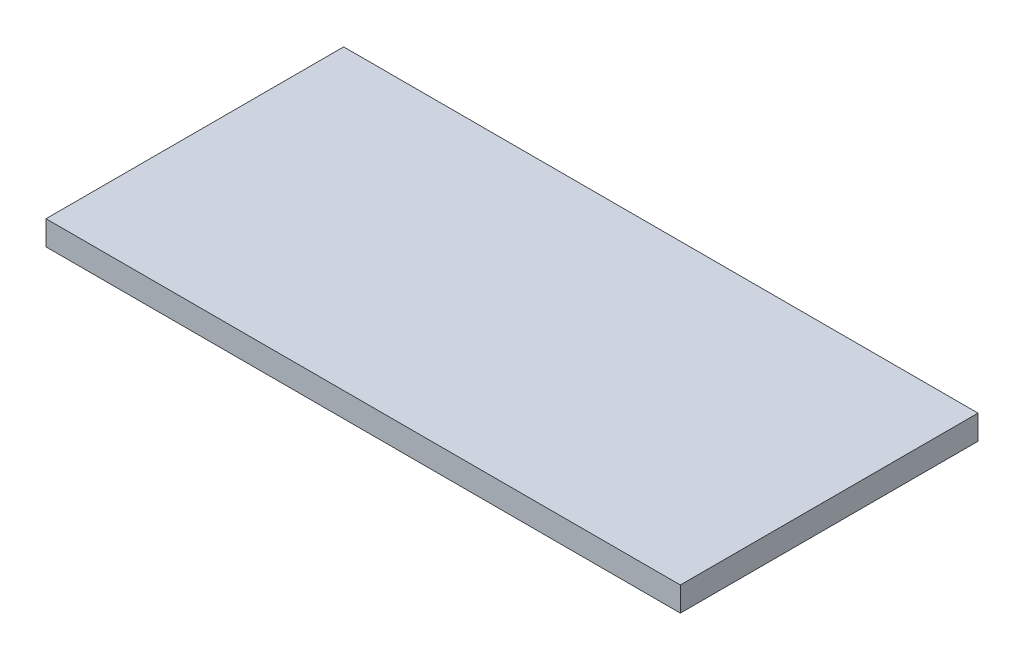
ISO-10303-21;
HEADER;
FILE_DESCRIPTION(('STEP AP214'),'2;1');
FILE_NAME('part.step','',(''),(''),'','','');
FILE_SCHEMA(('AUTOMOTIVE_DESIGN { 1 0 10303 214 1 1 1 1 }'));
ENDSEC;
DATA;
#1=APPLICATION_CONTEXT('core data for automotive mechanical design processes');
#2=APPLICATION_PROTOCOL_DEFINITION('international standard','automotive_design',2000,#1);
#3=PRODUCT_CONTEXT('',#1,'mechanical');
#4=PRODUCT('Part','Part','',(#3));
#5=PRODUCT_RELATED_PRODUCT_CATEGORY('part','',(#4));
#6=PRODUCT_DEFINITION_FORMATION('','',#4);
#7=PRODUCT_DEFINITION_CONTEXT('part definition',#1,'design');
#8=PRODUCT_DEFINITION('design','',#6,#7);
#9=PRODUCT_DEFINITION_SHAPE('','',#8);
#10=(LENGTH_UNIT() NAMED_UNIT(*) SI_UNIT(.MILLI.,.METRE.));
#11=(NAMED_UNIT(*) PLANE_ANGLE_UNIT() SI_UNIT($,.RADIAN.));
#12=(NAMED_UNIT(*) SI_UNIT($,.STERADIAN.) SOLID_ANGLE_UNIT());
#13=UNCERTAINTY_MEASURE_WITH_UNIT(LENGTH_MEASURE(1.E-05),#10,'distance_accuracy_value','');
#14=(GEOMETRIC_REPRESENTATION_CONTEXT(3) GLOBAL_UNCERTAINTY_ASSIGNED_CONTEXT((#13)) GLOBAL_UNIT_ASSIGNED_CONTEXT((#10,
#11,#12)) REPRESENTATION_CONTEXT('',''));
#15=CARTESIAN_POINT('',(0.,0.,0.));
#16=DIRECTION('',(0.,0.,1.));
#17=DIRECTION('',(1.,0.,0.));
#18=AXIS2_PLACEMENT_3D('',#15,#16,#17);
#19=CARTESIAN_POINT('',(-40.5105633802817,5.,5.14436619718311));
#20=DIRECTION('',(1.,0.,0.));
#21=DIRECTION('',(0.,0.,-1.));
#22=AXIS2_PLACEMENT_3D('',#19,#20,#21);
#23=PLANE('',#22);
#24=DIRECTION('',(0.,0.,1.));
#25=VECTOR('',#24,1.);
#26=CARTESIAN_POINT('',(-40.5105633802817,0.,5.14436619718311));
#27=LINE('',#26,#25);
#28=CARTESIAN_POINT('',(-40.5105633802817,0.,5.14436619718311));
#29=VERTEX_POINT('',#28);
#30=CARTESIAN_POINT('',(-40.5105633802817,0.,66.1443661971831));
#31=VERTEX_POINT('',#30);
#32=EDGE_CURVE('E96',#29,#31,#27,.T.);
#33=ORIENTED_EDGE('',*,*,#32,.T.);
#34=DIRECTION('',(0.,-1.,0.));
#35=VECTOR('',#34,1.);
#36=CARTESIAN_POINT('',(-40.5105633802817,5.,66.1443661971831));
#37=LINE('',#36,#35);
#38=CARTESIAN_POINT('',(-40.5105633802817,5.,66.1443661971831));
#39=VERTEX_POINT('',#38);
#40=EDGE_CURVE('E11',#39,#31,#37,.T.);
#41=ORIENTED_EDGE('',*,*,#40,.F.);
#42=DIRECTION('',(0.,0.,1.));
#43=VECTOR('',#42,1.);
#44=CARTESIAN_POINT('',(-40.5105633802817,5.,5.14436619718311));
#45=LINE('',#44,#43);
#46=CARTESIAN_POINT('',(-40.5105633802817,5.,5.14436619718311));
#47=VERTEX_POINT('',#46);
#48=EDGE_CURVE('E84',#47,#39,#45,.T.);
#49=ORIENTED_EDGE('',*,*,#48,.F.);
#50=DIRECTION('',(0.,-1.,0.));
#51=VECTOR('',#50,1.);
#52=CARTESIAN_POINT('',(-40.5105633802817,5.,5.14436619718311));
#53=LINE('',#52,#51);
#54=EDGE_CURVE('E92',#47,#29,#53,.T.);
#55=ORIENTED_EDGE('',*,*,#54,.T.);
#56=EDGE_LOOP('',(#33,#41,#49,#55));
#57=FACE_BOUND('',#56,.T.);
#58=ADVANCED_FACE('F33',(#57),#23,.F.);
#59=CARTESIAN_POINT('',(-40.5105633802817,5.,66.1443661971831));
#60=DIRECTION('',(0.,0.,-1.));
#61=DIRECTION('',(-1.,0.,0.));
#62=AXIS2_PLACEMENT_3D('',#59,#60,#61);
#63=PLANE('',#62);
#64=DIRECTION('',(1.,0.,0.));
#65=VECTOR('',#64,1.);
#66=CARTESIAN_POINT('',(-40.5105633802817,0.,66.1443661971831));
#67=LINE('',#66,#65);
#68=CARTESIAN_POINT('',(89.4894366197183,0.,66.1443661971831));
#69=VERTEX_POINT('',#68);
#70=EDGE_CURVE('E88',#31,#69,#67,.T.);
#71=ORIENTED_EDGE('',*,*,#70,.T.);
#72=DIRECTION('',(0.,-1.,0.));
#73=VECTOR('',#72,1.);
#74=CARTESIAN_POINT('',(89.4894366197183,5.,66.1443661971831));
#75=LINE('',#74,#73);
#76=CARTESIAN_POINT('',(89.4894366197183,5.,66.1443661971831));
#77=VERTEX_POINT('',#76);
#78=EDGE_CURVE('E41',#77,#69,#75,.T.);
#79=ORIENTED_EDGE('',*,*,#78,.F.);
#80=DIRECTION('',(1.,0.,0.));
#81=VECTOR('',#80,1.);
#82=CARTESIAN_POINT('',(-40.5105633802817,5.,66.1443661971831));
#83=LINE('',#82,#81);
#84=EDGE_CURVE('E79',#39,#77,#83,.T.);
#85=ORIENTED_EDGE('',*,*,#84,.F.);
#86=ORIENTED_EDGE('',*,*,#40,.T.);
#87=EDGE_LOOP('',(#71,#79,#85,#86));
#88=FACE_BOUND('',#87,.T.);
#89=ADVANCED_FACE('F87',(#88),#63,.F.);
#90=CARTESIAN_POINT('',(89.4894366197183,5.,5.14436619718311));
#91=DIRECTION('',(-1.,0.,0.));
#92=DIRECTION('',(0.,0.,1.));
#93=AXIS2_PLACEMENT_3D('',#90,#91,#92);
#94=PLANE('',#93);
#95=DIRECTION('',(0.,0.,-1.));
#96=VECTOR('',#95,1.);
#97=CARTESIAN_POINT('',(89.4894366197183,0.,5.14436619718311));
#98=LINE('',#97,#96);
#99=CARTESIAN_POINT('',(89.4894366197183,0.,5.14436619718311));
#100=VERTEX_POINT('',#99);
#101=EDGE_CURVE('E66',#69,#100,#98,.T.);
#102=ORIENTED_EDGE('',*,*,#101,.T.);
#103=DIRECTION('',(0.,-1.,0.));
#104=VECTOR('',#103,1.);
#105=CARTESIAN_POINT('',(89.4894366197183,5.,5.14436619718311));
#106=LINE('',#105,#104);
#107=CARTESIAN_POINT('',(89.4894366197183,5.,5.14436619718311));
#108=VERTEX_POINT('',#107);
#109=EDGE_CURVE('E89',#108,#100,#106,.T.);
#110=ORIENTED_EDGE('',*,*,#109,.F.);
#111=DIRECTION('',(0.,0.,-1.));
#112=VECTOR('',#111,1.);
#113=CARTESIAN_POINT('',(89.4894366197183,5.,5.14436619718311));
#114=LINE('',#113,#112);
#115=EDGE_CURVE('E82',#77,#108,#114,.T.);
#116=ORIENTED_EDGE('',*,*,#115,.F.);
#117=ORIENTED_EDGE('',*,*,#78,.T.);
#118=EDGE_LOOP('',(#102,#110,#116,#117));
#119=FACE_BOUND('',#118,.T.);
#120=ADVANCED_FACE('F90',(#119),#94,.F.);
#121=CARTESIAN_POINT('',(-40.5105633802817,5.,5.14436619718311));
#122=DIRECTION('',(0.,0.,1.));
#123=DIRECTION('',(1.,0.,0.));
#124=AXIS2_PLACEMENT_3D('',#121,#122,#123);
#125=PLANE('',#124);
#126=DIRECTION('',(-1.,0.,0.));
#127=VECTOR('',#126,1.);
#128=CARTESIAN_POINT('',(-40.5105633802817,0.,5.14436619718311));
#129=LINE('',#128,#127);
#130=EDGE_CURVE('E72',#100,#29,#129,.T.);
#131=ORIENTED_EDGE('',*,*,#130,.T.);
#132=ORIENTED_EDGE('',*,*,#54,.F.);
#133=DIRECTION('',(-1.,0.,0.));
#134=VECTOR('',#133,1.);
#135=CARTESIAN_POINT('',(-40.5105633802817,5.,5.14436619718311));
#136=LINE('',#135,#134);
#137=EDGE_CURVE('E49',#108,#47,#136,.T.);
#138=ORIENTED_EDGE('',*,*,#137,.F.);
#139=ORIENTED_EDGE('',*,*,#109,.T.);
#140=EDGE_LOOP('',(#131,#132,#138,#139));
#141=FACE_BOUND('',#140,.T.);
#142=ADVANCED_FACE('F103',(#141),#125,.F.);
#143=CARTESIAN_POINT('',(0.,5.,0.));
#144=DIRECTION('',(0.,1.,0.));
#145=DIRECTION('',(0.,0.,1.));
#146=AXIS2_PLACEMENT_3D('',#143,#144,#145);
#147=PLANE('',#146);
#148=ORIENTED_EDGE('',*,*,#48,.T.);
#149=ORIENTED_EDGE('',*,*,#84,.T.);
#150=ORIENTED_EDGE('',*,*,#115,.T.);
#151=ORIENTED_EDGE('',*,*,#137,.T.);
#152=EDGE_LOOP('',(#148,#149,#150,#151));
#153=FACE_BOUND('',#152,.T.);
#154=ADVANCED_FACE('F80',(#153),#147,.T.);
#155=CARTESIAN_POINT('',(0.,0.,0.));
#156=DIRECTION('',(0.,1.,0.));
#157=DIRECTION('',(0.,0.,1.));
#158=AXIS2_PLACEMENT_3D('',#155,#156,#157);
#159=PLANE('',#158);
#160=ORIENTED_EDGE('',*,*,#32,.F.);
#161=ORIENTED_EDGE('',*,*,#130,.F.);
#162=ORIENTED_EDGE('',*,*,#101,.F.);
#163=ORIENTED_EDGE('',*,*,#70,.F.);
#164=EDGE_LOOP('',(#160,#161,#162,#163));
#165=FACE_BOUND('',#164,.T.);
#166=ADVANCED_FACE('F106',(#165),#159,.F.);
#167=CLOSED_SHELL('',(#58,#89,#120,#142,#154,#166));
#168=MANIFOLD_SOLID_BREP('B2',#167);
#169=ADVANCED_BREP_SHAPE_REPRESENTATION('',(#18,#168),#14);
#170=SHAPE_DEFINITION_REPRESENTATION(#9,#169);
ENDSEC;
END-ISO-10303-21;
